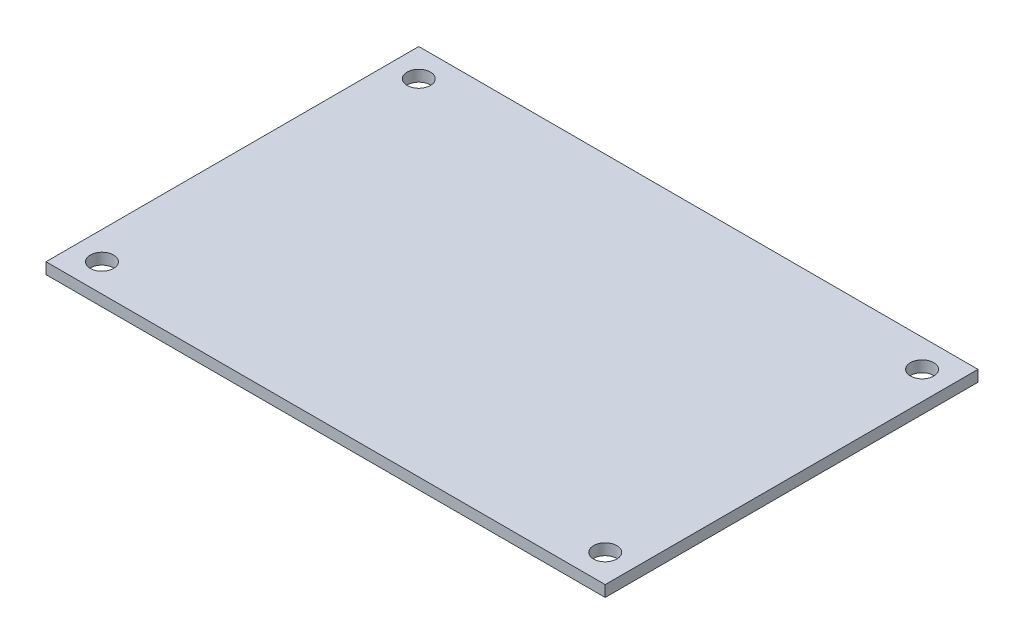
ISO-10303-21;
HEADER;
FILE_DESCRIPTION(('STEP AP214'),'2;1');
FILE_NAME('part.step','',(''),(''),'','','');
FILE_SCHEMA(('AUTOMOTIVE_DESIGN { 1 0 10303 214 1 1 1 1 }'));
ENDSEC;
DATA;
#1=APPLICATION_CONTEXT('core data for automotive mechanical design processes');
#2=APPLICATION_PROTOCOL_DEFINITION('international standard','automotive_design',2000,#1);
#3=PRODUCT_CONTEXT('',#1,'mechanical');
#4=PRODUCT('Part','Part','',(#3));
#5=PRODUCT_RELATED_PRODUCT_CATEGORY('part','',(#4));
#6=PRODUCT_DEFINITION_FORMATION('','',#4);
#7=PRODUCT_DEFINITION_CONTEXT('part definition',#1,'design');
#8=PRODUCT_DEFINITION('design','',#6,#7);
#9=PRODUCT_DEFINITION_SHAPE('','',#8);
#10=(LENGTH_UNIT() NAMED_UNIT(*) SI_UNIT(.MILLI.,.METRE.));
#11=(NAMED_UNIT(*) PLANE_ANGLE_UNIT() SI_UNIT($,.RADIAN.));
#12=(NAMED_UNIT(*) SI_UNIT($,.STERADIAN.) SOLID_ANGLE_UNIT());
#13=UNCERTAINTY_MEASURE_WITH_UNIT(LENGTH_MEASURE(1.E-05),#10,'distance_accuracy_value','');
#14=(GEOMETRIC_REPRESENTATION_CONTEXT(3) GLOBAL_UNCERTAINTY_ASSIGNED_CONTEXT((#13)) GLOBAL_UNIT_ASSIGNED_CONTEXT((#10,
#11,#12)) REPRESENTATION_CONTEXT('',''));
#15=CARTESIAN_POINT('',(0.,0.,0.));
#16=DIRECTION('',(0.,0.,1.));
#17=DIRECTION('',(1.,0.,0.));
#18=AXIS2_PLACEMENT_3D('',#15,#16,#17);
#19=CARTESIAN_POINT('',(0.,1.524,0.));
#20=DIRECTION('',(0.,-1.,0.));
#21=DIRECTION('',(0.,0.,-1.));
#22=AXIS2_PLACEMENT_3D('',#19,#20,#21);
#23=PLANE('',#22);
#24=CARTESIAN_POINT('',(-34.29,1.524,21.59));
#25=DIRECTION('',(0.,1.,0.));
#26=DIRECTION('',(0.,0.,1.));
#27=AXIS2_PLACEMENT_3D('',#24,#25,#26);
#28=CIRCLE('',#27,1.5875);
#29=CARTESIAN_POINT('',(-34.29,1.524,20.0025));
#30=VERTEX_POINT('',#29);
#31=EDGE_CURVE('E121',#30,#30,#28,.T.);
#32=ORIENTED_EDGE('',*,*,#31,.F.);
#33=EDGE_LOOP('',(#32));
#34=FACE_BOUND('',#33,.T.);
#35=CARTESIAN_POINT('',(34.29,1.524,-21.59));
#36=DIRECTION('',(0.,1.,0.));
#37=DIRECTION('',(0.,0.,1.));
#38=AXIS2_PLACEMENT_3D('',#35,#36,#37);
#39=CIRCLE('',#38,1.5875);
#40=CARTESIAN_POINT('',(34.29,1.524,-23.1775));
#41=VERTEX_POINT('',#40);
#42=EDGE_CURVE('E100',#41,#41,#39,.T.);
#43=ORIENTED_EDGE('',*,*,#42,.F.);
#44=EDGE_LOOP('',(#43));
#45=FACE_BOUND('',#44,.T.);
#46=DIRECTION('',(0.,0.,-1.));
#47=VECTOR('',#46,1.);
#48=CARTESIAN_POINT('',(38.1,1.524,25.4));
#49=LINE('',#48,#47);
#50=CARTESIAN_POINT('',(38.1,1.524,25.4));
#51=VERTEX_POINT('',#50);
#52=CARTESIAN_POINT('',(38.1,1.524,-25.4));
#53=VERTEX_POINT('',#52);
#54=EDGE_CURVE('E85',#51,#53,#49,.T.);
#55=ORIENTED_EDGE('',*,*,#54,.T.);
#56=DIRECTION('',(-1.,0.,0.));
#57=VECTOR('',#56,1.);
#58=CARTESIAN_POINT('',(-38.1,1.524,-25.4));
#59=LINE('',#58,#57);
#60=CARTESIAN_POINT('',(-38.1,1.524,-25.4));
#61=VERTEX_POINT('',#60);
#62=EDGE_CURVE('E80',#53,#61,#59,.T.);
#63=ORIENTED_EDGE('',*,*,#62,.T.);
#64=DIRECTION('',(0.,0.,1.));
#65=VECTOR('',#64,1.);
#66=CARTESIAN_POINT('',(-38.1,1.524,25.4));
#67=LINE('',#66,#65);
#68=CARTESIAN_POINT('',(-38.1,1.524,25.4));
#69=VERTEX_POINT('',#68);
#70=EDGE_CURVE('E83',#61,#69,#67,.T.);
#71=ORIENTED_EDGE('',*,*,#70,.T.);
#72=DIRECTION('',(1.,0.,0.));
#73=VECTOR('',#72,1.);
#74=CARTESIAN_POINT('',(-38.1,1.524,25.4));
#75=LINE('',#74,#73);
#76=EDGE_CURVE('E50',#69,#51,#75,.T.);
#77=ORIENTED_EDGE('',*,*,#76,.T.);
#78=EDGE_LOOP('',(#55,#63,#71,#77));
#79=FACE_BOUND('',#78,.T.);
#80=CARTESIAN_POINT('',(34.29,1.524,21.59));
#81=DIRECTION('',(0.,1.,0.));
#82=DIRECTION('',(0.,0.,1.));
#83=AXIS2_PLACEMENT_3D('',#80,#81,#82);
#84=CIRCLE('',#83,1.5875);
#85=CARTESIAN_POINT('',(34.29,1.524,20.0025));
#86=VERTEX_POINT('',#85);
#87=EDGE_CURVE('E115',#86,#86,#84,.T.);
#88=ORIENTED_EDGE('',*,*,#87,.F.);
#89=EDGE_LOOP('',(#88));
#90=FACE_BOUND('',#89,.T.);
#91=CARTESIAN_POINT('',(-34.29,1.524,-21.59));
#92=DIRECTION('',(0.,1.,0.));
#93=DIRECTION('',(0.,0.,1.));
#94=AXIS2_PLACEMENT_3D('',#91,#92,#93);
#95=CIRCLE('',#94,1.5875);
#96=CARTESIAN_POINT('',(-34.29,1.524,-23.1775));
#97=VERTEX_POINT('',#96);
#98=EDGE_CURVE('E127',#97,#97,#95,.T.);
#99=ORIENTED_EDGE('',*,*,#98,.F.);
#100=EDGE_LOOP('',(#99));
#101=FACE_BOUND('',#100,.T.);
#102=ADVANCED_FACE('F33',(#34,#45,#79,#90,#101),#23,.F.);
#103=CARTESIAN_POINT('',(0.,0.,0.));
#104=DIRECTION('',(0.,-1.,0.));
#105=DIRECTION('',(0.,0.,-1.));
#106=AXIS2_PLACEMENT_3D('',#103,#104,#105);
#107=PLANE('',#106);
#108=CARTESIAN_POINT('',(-34.29,0.,21.59));
#109=DIRECTION('',(0.,1.,0.));
#110=DIRECTION('',(0.,0.,1.));
#111=AXIS2_PLACEMENT_3D('',#108,#109,#110);
#112=CIRCLE('',#111,1.5875);
#113=CARTESIAN_POINT('',(-34.29,0.,20.0025));
#114=VERTEX_POINT('',#113);
#115=EDGE_CURVE('E124',#114,#114,#112,.T.);
#116=ORIENTED_EDGE('',*,*,#115,.T.);
#117=EDGE_LOOP('',(#116));
#118=FACE_BOUND('',#117,.T.);
#119=CARTESIAN_POINT('',(34.29,0.,-21.59));
#120=DIRECTION('',(0.,1.,0.));
#121=DIRECTION('',(0.,0.,1.));
#122=AXIS2_PLACEMENT_3D('',#119,#120,#121);
#123=CIRCLE('',#122,1.5875);
#124=CARTESIAN_POINT('',(34.29,0.,-23.1775));
#125=VERTEX_POINT('',#124);
#126=EDGE_CURVE('E112',#125,#125,#123,.T.);
#127=ORIENTED_EDGE('',*,*,#126,.T.);
#128=EDGE_LOOP('',(#127));
#129=FACE_BOUND('',#128,.T.);
#130=DIRECTION('',(0.,0.,-1.));
#131=VECTOR('',#130,1.);
#132=CARTESIAN_POINT('',(38.1,0.,25.4));
#133=LINE('',#132,#131);
#134=CARTESIAN_POINT('',(38.1,0.,25.4));
#135=VERTEX_POINT('',#134);
#136=CARTESIAN_POINT('',(38.1,0.,-25.4));
#137=VERTEX_POINT('',#136);
#138=EDGE_CURVE('E97',#135,#137,#133,.T.);
#139=ORIENTED_EDGE('',*,*,#138,.F.);
#140=DIRECTION('',(1.,0.,0.));
#141=VECTOR('',#140,1.);
#142=CARTESIAN_POINT('',(-38.1,0.,25.4));
#143=LINE('',#142,#141);
#144=CARTESIAN_POINT('',(-38.1,0.,25.4));
#145=VERTEX_POINT('',#144);
#146=EDGE_CURVE('E73',#145,#135,#143,.T.);
#147=ORIENTED_EDGE('',*,*,#146,.F.);
#148=DIRECTION('',(0.,0.,1.));
#149=VECTOR('',#148,1.);
#150=CARTESIAN_POINT('',(-38.1,0.,25.4));
#151=LINE('',#150,#149);
#152=CARTESIAN_POINT('',(-38.1,0.,-25.4));
#153=VERTEX_POINT('',#152);
#154=EDGE_CURVE('E67',#153,#145,#151,.T.);
#155=ORIENTED_EDGE('',*,*,#154,.F.);
#156=DIRECTION('',(-1.,0.,0.));
#157=VECTOR('',#156,1.);
#158=CARTESIAN_POINT('',(-38.1,0.,-25.4));
#159=LINE('',#158,#157);
#160=EDGE_CURVE('E89',#137,#153,#159,.T.);
#161=ORIENTED_EDGE('',*,*,#160,.F.);
#162=EDGE_LOOP('',(#139,#147,#155,#161));
#163=FACE_BOUND('',#162,.T.);
#164=CARTESIAN_POINT('',(34.29,0.,21.59));
#165=DIRECTION('',(0.,1.,0.));
#166=DIRECTION('',(0.,0.,1.));
#167=AXIS2_PLACEMENT_3D('',#164,#165,#166);
#168=CIRCLE('',#167,1.5875);
#169=CARTESIAN_POINT('',(34.29,0.,20.0025));
#170=VERTEX_POINT('',#169);
#171=EDGE_CURVE('E118',#170,#170,#168,.T.);
#172=ORIENTED_EDGE('',*,*,#171,.T.);
#173=EDGE_LOOP('',(#172));
#174=FACE_BOUND('',#173,.T.);
#175=CARTESIAN_POINT('',(-34.29,0.,-21.59));
#176=DIRECTION('',(0.,1.,0.));
#177=DIRECTION('',(0.,0.,1.));
#178=AXIS2_PLACEMENT_3D('',#175,#176,#177);
#179=CIRCLE('',#178,1.5875);
#180=CARTESIAN_POINT('',(-34.29,0.,-23.1775));
#181=VERTEX_POINT('',#180);
#182=EDGE_CURVE('E130',#181,#181,#179,.T.);
#183=ORIENTED_EDGE('',*,*,#182,.T.);
#184=EDGE_LOOP('',(#183));
#185=FACE_BOUND('',#184,.T.);
#186=ADVANCED_FACE('F108',(#118,#129,#163,#174,#185),#107,.T.);
#187=CARTESIAN_POINT('',(38.1,1.524,25.4));
#188=DIRECTION('',(-1.,0.,0.));
#189=DIRECTION('',(0.,0.,1.));
#190=AXIS2_PLACEMENT_3D('',#187,#188,#189);
#191=PLANE('',#190);
#192=ORIENTED_EDGE('',*,*,#138,.T.);
#193=DIRECTION('',(0.,-1.,0.));
#194=VECTOR('',#193,1.);
#195=CARTESIAN_POINT('',(38.1,1.524,-25.4));
#196=LINE('',#195,#194);
#197=EDGE_CURVE('E11',#53,#137,#196,.T.);
#198=ORIENTED_EDGE('',*,*,#197,.F.);
#199=ORIENTED_EDGE('',*,*,#54,.F.);
#200=DIRECTION('',(0.,-1.,0.));
#201=VECTOR('',#200,1.);
#202=CARTESIAN_POINT('',(38.1,1.524,25.4));
#203=LINE('',#202,#201);
#204=EDGE_CURVE('E93',#51,#135,#203,.T.);
#205=ORIENTED_EDGE('',*,*,#204,.T.);
#206=EDGE_LOOP('',(#192,#198,#199,#205));
#207=FACE_BOUND('',#206,.T.);
#208=ADVANCED_FACE('F35',(#207),#191,.F.);
#209=CARTESIAN_POINT('',(-38.1,1.524,-25.4));
#210=DIRECTION('',(0.,0.,1.));
#211=DIRECTION('',(1.,0.,0.));
#212=AXIS2_PLACEMENT_3D('',#209,#210,#211);
#213=PLANE('',#212);
#214=ORIENTED_EDGE('',*,*,#160,.T.);
#215=DIRECTION('',(0.,-1.,0.));
#216=VECTOR('',#215,1.);
#217=CARTESIAN_POINT('',(-38.1,1.524,-25.4));
#218=LINE('',#217,#216);
#219=EDGE_CURVE('E42',#61,#153,#218,.T.);
#220=ORIENTED_EDGE('',*,*,#219,.F.);
#221=ORIENTED_EDGE('',*,*,#62,.F.);
#222=ORIENTED_EDGE('',*,*,#197,.T.);
#223=EDGE_LOOP('',(#214,#220,#221,#222));
#224=FACE_BOUND('',#223,.T.);
#225=ADVANCED_FACE('F88',(#224),#213,.F.);
#226=CARTESIAN_POINT('',(-38.1,1.524,25.4));
#227=DIRECTION('',(1.,0.,0.));
#228=DIRECTION('',(0.,0.,-1.));
#229=AXIS2_PLACEMENT_3D('',#226,#227,#228);
#230=PLANE('',#229);
#231=ORIENTED_EDGE('',*,*,#154,.T.);
#232=DIRECTION('',(0.,-1.,0.));
#233=VECTOR('',#232,1.);
#234=CARTESIAN_POINT('',(-38.1,1.524,25.4));
#235=LINE('',#234,#233);
#236=EDGE_CURVE('E90',#69,#145,#235,.T.);
#237=ORIENTED_EDGE('',*,*,#236,.F.);
#238=ORIENTED_EDGE('',*,*,#70,.F.);
#239=ORIENTED_EDGE('',*,*,#219,.T.);
#240=EDGE_LOOP('',(#231,#237,#238,#239));
#241=FACE_BOUND('',#240,.T.);
#242=ADVANCED_FACE('F91',(#241),#230,.F.);
#243=CARTESIAN_POINT('',(-38.1,1.524,25.4));
#244=DIRECTION('',(0.,0.,-1.));
#245=DIRECTION('',(-1.,0.,0.));
#246=AXIS2_PLACEMENT_3D('',#243,#244,#245);
#247=PLANE('',#246);
#248=ORIENTED_EDGE('',*,*,#146,.T.);
#249=ORIENTED_EDGE('',*,*,#204,.F.);
#250=ORIENTED_EDGE('',*,*,#76,.F.);
#251=ORIENTED_EDGE('',*,*,#236,.T.);
#252=EDGE_LOOP('',(#248,#249,#250,#251));
#253=FACE_BOUND('',#252,.T.);
#254=ADVANCED_FACE('F105',(#253),#247,.F.);
#255=CARTESIAN_POINT('',(34.29,1.524,-21.59));
#256=DIRECTION('',(0.,-1.,0.));
#257=DIRECTION('',(0.,0.,-1.));
#258=AXIS2_PLACEMENT_3D('',#255,#256,#257);
#259=CYLINDRICAL_SURFACE('',#258,1.5875);
#260=CARTESIAN_POINT('',(34.29,1.524,-23.1775));
#261=CARTESIAN_POINT('',(34.29,1.508125,-23.1775));
#262=CARTESIAN_POINT('',(34.29,1.49225,-23.1775));
#263=CARTESIAN_POINT('',(34.29,1.4605,-23.1775));
#264=CARTESIAN_POINT('',(34.29,1.444625,-23.1775));
#265=CARTESIAN_POINT('',(34.29,1.412875,-23.1775));
#266=CARTESIAN_POINT('',(34.29,1.397,-23.1775));
#267=CARTESIAN_POINT('',(34.29,1.36525,-23.1775));
#268=CARTESIAN_POINT('',(34.29,1.349375,-23.1775));
#269=CARTESIAN_POINT('',(34.29,1.317625,-23.1775));
#270=CARTESIAN_POINT('',(34.29,1.30175,-23.1775));
#271=CARTESIAN_POINT('',(34.29,1.27,-23.1775));
#272=CARTESIAN_POINT('',(34.29,1.254125,-23.1775));
#273=CARTESIAN_POINT('',(34.29,1.222375,-23.1775));
#274=CARTESIAN_POINT('',(34.29,1.2065,-23.1775));
#275=CARTESIAN_POINT('',(34.29,1.17475,-23.1775));
#276=CARTESIAN_POINT('',(34.29,1.158875,-23.1775));
#277=CARTESIAN_POINT('',(34.29,1.127125,-23.1775));
#278=CARTESIAN_POINT('',(34.29,1.11125,-23.1775));
#279=CARTESIAN_POINT('',(34.29,1.0795,-23.1775));
#280=CARTESIAN_POINT('',(34.29,1.063625,-23.1775));
#281=CARTESIAN_POINT('',(34.29,1.031875,-23.1775));
#282=CARTESIAN_POINT('',(34.29,1.016,-23.1775));
#283=CARTESIAN_POINT('',(34.29,0.98425,-23.1775));
#284=CARTESIAN_POINT('',(34.29,0.968375,-23.1775));
#285=CARTESIAN_POINT('',(34.29,0.936625,-23.1775));
#286=CARTESIAN_POINT('',(34.29,0.92075,-23.1775));
#287=CARTESIAN_POINT('',(34.29,0.889,-23.1775));
#288=CARTESIAN_POINT('',(34.29,0.873125,-23.1775));
#289=CARTESIAN_POINT('',(34.29,0.841375,-23.1775));
#290=CARTESIAN_POINT('',(34.29,0.8255,-23.1775));
#291=CARTESIAN_POINT('',(34.29,0.79375,-23.1775));
#292=CARTESIAN_POINT('',(34.29,0.777875,-23.1775));
#293=CARTESIAN_POINT('',(34.29,0.746125,-23.1775));
#294=CARTESIAN_POINT('',(34.29,0.73025,-23.1775));
#295=CARTESIAN_POINT('',(34.29,0.6985,-23.1775));
#296=CARTESIAN_POINT('',(34.29,0.682625,-23.1775));
#297=CARTESIAN_POINT('',(34.29,0.650875,-23.1775));
#298=CARTESIAN_POINT('',(34.29,0.635,-23.1775));
#299=CARTESIAN_POINT('',(34.29,0.60325,-23.1775));
#300=CARTESIAN_POINT('',(34.29,0.587375,-23.1775));
#301=CARTESIAN_POINT('',(34.29,0.555625,-23.1775));
#302=CARTESIAN_POINT('',(34.29,0.53975,-23.1775));
#303=CARTESIAN_POINT('',(34.29,0.508,-23.1775));
#304=CARTESIAN_POINT('',(34.29,0.492125,-23.1775));
#305=CARTESIAN_POINT('',(34.29,0.460375,-23.1775));
#306=CARTESIAN_POINT('',(34.29,0.4445,-23.1775));
#307=CARTESIAN_POINT('',(34.29,0.41275,-23.1775));
#308=CARTESIAN_POINT('',(34.29,0.396875,-23.1775));
#309=CARTESIAN_POINT('',(34.29,0.365125,-23.1775));
#310=CARTESIAN_POINT('',(34.29,0.34925,-23.1775));
#311=CARTESIAN_POINT('',(34.29,0.3175,-23.1775));
#312=CARTESIAN_POINT('',(34.29,0.301625,-23.1775));
#313=CARTESIAN_POINT('',(34.29,0.269875,-23.1775));
#314=CARTESIAN_POINT('',(34.29,0.254,-23.1775));
#315=CARTESIAN_POINT('',(34.29,0.22225,-23.1775));
#316=CARTESIAN_POINT('',(34.29,0.206375,-23.1775));
#317=CARTESIAN_POINT('',(34.29,0.174625,-23.1775));
#318=CARTESIAN_POINT('',(34.29,0.15875,-23.1775));
#319=CARTESIAN_POINT('',(34.29,0.127,-23.1775));
#320=CARTESIAN_POINT('',(34.29,0.111125,-23.1775));
#321=CARTESIAN_POINT('',(34.29,0.079375,-23.1775));
#322=CARTESIAN_POINT('',(34.29,0.0635,-23.1775));
#323=CARTESIAN_POINT('',(34.29,0.0317499999999999,-23.1775));
#324=CARTESIAN_POINT('',(34.29,0.015875,-23.1775));
#325=CARTESIAN_POINT('',(34.29,0.,-23.1775));
#326=B_SPLINE_CURVE_WITH_KNOTS('',3,(#260,#261,#262,#263,#264,#265,#266,#267,#268,#269,#270,
#271,#272,#273,#274,#275,#276,#277,#278,#279,#280,#281,#282,#283,#284,#285,#286,#287,#288,#289,
#290,#291,#292,#293,#294,#295,#296,#297,#298,#299,#300,#301,#302,#303,#304,#305,#306,#307,#308,
#309,#310,#311,#312,#313,#314,#315,#316,#317,#318,#319,#320,#321,#322,#323,#324,#325),
.UNSPECIFIED.,.F.,.F.,(4,2,2,2,2,2,2,2,2,2,2,2,2,2,2,2,2,2,2,2,2,2,2,2,2,2,2,2,2,2,2,2,4),(0.,
0.0476250000000001,0.0952500000000001,0.142875,0.1905,0.238125,0.28575,0.333375,0.381,0.428625,
0.47625,0.523875,0.5715,0.619125,0.66675,0.714375,0.762,0.809625,0.85725,0.904875,0.9525,
1.000125,1.04775,1.095375,1.143,1.190625,1.23825,1.285875,1.3335,1.381125,1.42875,1.476375,
1.524),.UNSPECIFIED.);
#327=EDGE_CURVE('BSEAM150',#41,#125,#326,.T.);
#328=ORIENTED_EDGE('',*,*,#42,.T.);
#329=ORIENTED_EDGE('',*,*,#126,.F.);
#330=ORIENTED_EDGE('',*,*,#327,.T.);
#331=ORIENTED_EDGE('',*,*,#327,.F.);
#332=EDGE_LOOP('',(#328,#330,#329,#331));
#333=FACE_BOUND('',#332,.T.);
#334=ADVANCED_FACE('F150',(#333),#259,.F.);
#335=CARTESIAN_POINT('',(34.29,1.524,21.59));
#336=DIRECTION('',(0.,-1.,0.));
#337=DIRECTION('',(0.,0.,-1.));
#338=AXIS2_PLACEMENT_3D('',#335,#336,#337);
#339=CYLINDRICAL_SURFACE('',#338,1.5875);
#340=CARTESIAN_POINT('',(34.29,1.524,20.0025));
#341=CARTESIAN_POINT('',(34.29,1.508125,20.0025));
#342=CARTESIAN_POINT('',(34.29,1.49225,20.0025));
#343=CARTESIAN_POINT('',(34.29,1.4605,20.0025));
#344=CARTESIAN_POINT('',(34.29,1.444625,20.0025));
#345=CARTESIAN_POINT('',(34.29,1.412875,20.0025));
#346=CARTESIAN_POINT('',(34.29,1.397,20.0025));
#347=CARTESIAN_POINT('',(34.29,1.36525,20.0025));
#348=CARTESIAN_POINT('',(34.29,1.349375,20.0025));
#349=CARTESIAN_POINT('',(34.29,1.317625,20.0025));
#350=CARTESIAN_POINT('',(34.29,1.30175,20.0025));
#351=CARTESIAN_POINT('',(34.29,1.27,20.0025));
#352=CARTESIAN_POINT('',(34.29,1.254125,20.0025));
#353=CARTESIAN_POINT('',(34.29,1.222375,20.0025));
#354=CARTESIAN_POINT('',(34.29,1.2065,20.0025));
#355=CARTESIAN_POINT('',(34.29,1.17475,20.0025));
#356=CARTESIAN_POINT('',(34.29,1.158875,20.0025));
#357=CARTESIAN_POINT('',(34.29,1.127125,20.0025));
#358=CARTESIAN_POINT('',(34.29,1.11125,20.0025));
#359=CARTESIAN_POINT('',(34.29,1.0795,20.0025));
#360=CARTESIAN_POINT('',(34.29,1.063625,20.0025));
#361=CARTESIAN_POINT('',(34.29,1.031875,20.0025));
#362=CARTESIAN_POINT('',(34.29,1.016,20.0025));
#363=CARTESIAN_POINT('',(34.29,0.98425,20.0025));
#364=CARTESIAN_POINT('',(34.29,0.968375,20.0025));
#365=CARTESIAN_POINT('',(34.29,0.936625,20.0025));
#366=CARTESIAN_POINT('',(34.29,0.92075,20.0025));
#367=CARTESIAN_POINT('',(34.29,0.889,20.0025));
#368=CARTESIAN_POINT('',(34.29,0.873125,20.0025));
#369=CARTESIAN_POINT('',(34.29,0.841375,20.0025));
#370=CARTESIAN_POINT('',(34.29,0.8255,20.0025));
#371=CARTESIAN_POINT('',(34.29,0.79375,20.0025));
#372=CARTESIAN_POINT('',(34.29,0.777875,20.0025));
#373=CARTESIAN_POINT('',(34.29,0.746125,20.0025));
#374=CARTESIAN_POINT('',(34.29,0.73025,20.0025));
#375=CARTESIAN_POINT('',(34.29,0.6985,20.0025));
#376=CARTESIAN_POINT('',(34.29,0.682625,20.0025));
#377=CARTESIAN_POINT('',(34.29,0.650875,20.0025));
#378=CARTESIAN_POINT('',(34.29,0.635,20.0025));
#379=CARTESIAN_POINT('',(34.29,0.60325,20.0025));
#380=CARTESIAN_POINT('',(34.29,0.587375,20.0025));
#381=CARTESIAN_POINT('',(34.29,0.555625,20.0025));
#382=CARTESIAN_POINT('',(34.29,0.53975,20.0025));
#383=CARTESIAN_POINT('',(34.29,0.508,20.0025));
#384=CARTESIAN_POINT('',(34.29,0.492125,20.0025));
#385=CARTESIAN_POINT('',(34.29,0.460375,20.0025));
#386=CARTESIAN_POINT('',(34.29,0.4445,20.0025));
#387=CARTESIAN_POINT('',(34.29,0.41275,20.0025));
#388=CARTESIAN_POINT('',(34.29,0.396875,20.0025));
#389=CARTESIAN_POINT('',(34.29,0.365125,20.0025));
#390=CARTESIAN_POINT('',(34.29,0.34925,20.0025));
#391=CARTESIAN_POINT('',(34.29,0.3175,20.0025));
#392=CARTESIAN_POINT('',(34.29,0.301625,20.0025));
#393=CARTESIAN_POINT('',(34.29,0.269875,20.0025));
#394=CARTESIAN_POINT('',(34.29,0.254,20.0025));
#395=CARTESIAN_POINT('',(34.29,0.22225,20.0025));
#396=CARTESIAN_POINT('',(34.29,0.206375,20.0025));
#397=CARTESIAN_POINT('',(34.29,0.174625,20.0025));
#398=CARTESIAN_POINT('',(34.29,0.15875,20.0025));
#399=CARTESIAN_POINT('',(34.29,0.127,20.0025));
#400=CARTESIAN_POINT('',(34.29,0.111125,20.0025));
#401=CARTESIAN_POINT('',(34.29,0.079375,20.0025));
#402=CARTESIAN_POINT('',(34.29,0.0635,20.0025));
#403=CARTESIAN_POINT('',(34.29,0.0317499999999999,20.0025));
#404=CARTESIAN_POINT('',(34.29,0.015875,20.0025));
#405=CARTESIAN_POINT('',(34.29,0.,20.0025));
#406=B_SPLINE_CURVE_WITH_KNOTS('',3,(#340,#341,#342,#343,#344,#345,#346,#347,#348,#349,#350,
#351,#352,#353,#354,#355,#356,#357,#358,#359,#360,#361,#362,#363,#364,#365,#366,#367,#368,#369,
#370,#371,#372,#373,#374,#375,#376,#377,#378,#379,#380,#381,#382,#383,#384,#385,#386,#387,#388,
#389,#390,#391,#392,#393,#394,#395,#396,#397,#398,#399,#400,#401,#402,#403,#404,#405),
.UNSPECIFIED.,.F.,.F.,(4,2,2,2,2,2,2,2,2,2,2,2,2,2,2,2,2,2,2,2,2,2,2,2,2,2,2,2,2,2,2,2,4),(0.,
0.0476250000000001,0.0952500000000001,0.142875,0.1905,0.238125,0.28575,0.333375,0.381,0.428625,
0.47625,0.523875,0.5715,0.619125,0.66675,0.714375,0.762,0.809625,0.85725,0.904875,0.9525,
1.000125,1.04775,1.095375,1.143,1.190625,1.23825,1.285875,1.3335,1.381125,1.42875,1.476375,
1.524),.UNSPECIFIED.);
#407=EDGE_CURVE('BSEAM196',#86,#170,#406,.T.);
#408=ORIENTED_EDGE('',*,*,#87,.T.);
#409=ORIENTED_EDGE('',*,*,#171,.F.);
#410=ORIENTED_EDGE('',*,*,#407,.T.);
#411=ORIENTED_EDGE('',*,*,#407,.F.);
#412=EDGE_LOOP('',(#408,#410,#409,#411));
#413=FACE_BOUND('',#412,.T.);
#414=ADVANCED_FACE('F196',(#413),#339,.F.);
#415=CARTESIAN_POINT('',(-34.29,1.524,21.59));
#416=DIRECTION('',(0.,-1.,0.));
#417=DIRECTION('',(0.,0.,-1.));
#418=AXIS2_PLACEMENT_3D('',#415,#416,#417);
#419=CYLINDRICAL_SURFACE('',#418,1.5875);
#420=CARTESIAN_POINT('',(-34.29,1.524,20.0025));
#421=CARTESIAN_POINT('',(-34.29,1.508125,20.0025));
#422=CARTESIAN_POINT('',(-34.29,1.49225,20.0025));
#423=CARTESIAN_POINT('',(-34.29,1.4605,20.0025));
#424=CARTESIAN_POINT('',(-34.29,1.444625,20.0025));
#425=CARTESIAN_POINT('',(-34.29,1.412875,20.0025));
#426=CARTESIAN_POINT('',(-34.29,1.397,20.0025));
#427=CARTESIAN_POINT('',(-34.29,1.36525,20.0025));
#428=CARTESIAN_POINT('',(-34.29,1.349375,20.0025));
#429=CARTESIAN_POINT('',(-34.29,1.317625,20.0025));
#430=CARTESIAN_POINT('',(-34.29,1.30175,20.0025));
#431=CARTESIAN_POINT('',(-34.29,1.27,20.0025));
#432=CARTESIAN_POINT('',(-34.29,1.254125,20.0025));
#433=CARTESIAN_POINT('',(-34.29,1.222375,20.0025));
#434=CARTESIAN_POINT('',(-34.29,1.2065,20.0025));
#435=CARTESIAN_POINT('',(-34.29,1.17475,20.0025));
#436=CARTESIAN_POINT('',(-34.29,1.158875,20.0025));
#437=CARTESIAN_POINT('',(-34.29,1.127125,20.0025));
#438=CARTESIAN_POINT('',(-34.29,1.11125,20.0025));
#439=CARTESIAN_POINT('',(-34.29,1.0795,20.0025));
#440=CARTESIAN_POINT('',(-34.29,1.063625,20.0025));
#441=CARTESIAN_POINT('',(-34.29,1.031875,20.0025));
#442=CARTESIAN_POINT('',(-34.29,1.016,20.0025));
#443=CARTESIAN_POINT('',(-34.29,0.98425,20.0025));
#444=CARTESIAN_POINT('',(-34.29,0.968375,20.0025));
#445=CARTESIAN_POINT('',(-34.29,0.936625,20.0025));
#446=CARTESIAN_POINT('',(-34.29,0.92075,20.0025));
#447=CARTESIAN_POINT('',(-34.29,0.889,20.0025));
#448=CARTESIAN_POINT('',(-34.29,0.873125,20.0025));
#449=CARTESIAN_POINT('',(-34.29,0.841375,20.0025));
#450=CARTESIAN_POINT('',(-34.29,0.8255,20.0025));
#451=CARTESIAN_POINT('',(-34.29,0.79375,20.0025));
#452=CARTESIAN_POINT('',(-34.29,0.777875,20.0025));
#453=CARTESIAN_POINT('',(-34.29,0.746125,20.0025));
#454=CARTESIAN_POINT('',(-34.29,0.73025,20.0025));
#455=CARTESIAN_POINT('',(-34.29,0.6985,20.0025));
#456=CARTESIAN_POINT('',(-34.29,0.682625,20.0025));
#457=CARTESIAN_POINT('',(-34.29,0.650875,20.0025));
#458=CARTESIAN_POINT('',(-34.29,0.635,20.0025));
#459=CARTESIAN_POINT('',(-34.29,0.60325,20.0025));
#460=CARTESIAN_POINT('',(-34.29,0.587375,20.0025));
#461=CARTESIAN_POINT('',(-34.29,0.555625,20.0025));
#462=CARTESIAN_POINT('',(-34.29,0.53975,20.0025));
#463=CARTESIAN_POINT('',(-34.29,0.508,20.0025));
#464=CARTESIAN_POINT('',(-34.29,0.492125,20.0025));
#465=CARTESIAN_POINT('',(-34.29,0.460375,20.0025));
#466=CARTESIAN_POINT('',(-34.29,0.4445,20.0025));
#467=CARTESIAN_POINT('',(-34.29,0.41275,20.0025));
#468=CARTESIAN_POINT('',(-34.29,0.396875,20.0025));
#469=CARTESIAN_POINT('',(-34.29,0.365125,20.0025));
#470=CARTESIAN_POINT('',(-34.29,0.34925,20.0025));
#471=CARTESIAN_POINT('',(-34.29,0.3175,20.0025));
#472=CARTESIAN_POINT('',(-34.29,0.301625,20.0025));
#473=CARTESIAN_POINT('',(-34.29,0.269875,20.0025));
#474=CARTESIAN_POINT('',(-34.29,0.254,20.0025));
#475=CARTESIAN_POINT('',(-34.29,0.22225,20.0025));
#476=CARTESIAN_POINT('',(-34.29,0.206375,20.0025));
#477=CARTESIAN_POINT('',(-34.29,0.174625,20.0025));
#478=CARTESIAN_POINT('',(-34.29,0.15875,20.0025));
#479=CARTESIAN_POINT('',(-34.29,0.127,20.0025));
#480=CARTESIAN_POINT('',(-34.29,0.111125,20.0025));
#481=CARTESIAN_POINT('',(-34.29,0.079375,20.0025));
#482=CARTESIAN_POINT('',(-34.29,0.0635,20.0025));
#483=CARTESIAN_POINT('',(-34.29,0.0317499999999999,20.0025));
#484=CARTESIAN_POINT('',(-34.29,0.015875,20.0025));
#485=CARTESIAN_POINT('',(-34.29,0.,20.0025));
#486=B_SPLINE_CURVE_WITH_KNOTS('',3,(#420,#421,#422,#423,#424,#425,#426,#427,#428,#429,#430,
#431,#432,#433,#434,#435,#436,#437,#438,#439,#440,#441,#442,#443,#444,#445,#446,#447,#448,#449,
#450,#451,#452,#453,#454,#455,#456,#457,#458,#459,#460,#461,#462,#463,#464,#465,#466,#467,#468,
#469,#470,#471,#472,#473,#474,#475,#476,#477,#478,#479,#480,#481,#482,#483,#484,#485),
.UNSPECIFIED.,.F.,.F.,(4,2,2,2,2,2,2,2,2,2,2,2,2,2,2,2,2,2,2,2,2,2,2,2,2,2,2,2,2,2,2,2,4),(0.,
0.0476250000000001,0.0952500000000001,0.142875,0.1905,0.238125,0.28575,0.333375,0.381,0.428625,
0.47625,0.523875,0.5715,0.619125,0.66675,0.714375,0.762,0.809625,0.85725,0.904875,0.9525,
1.000125,1.04775,1.095375,1.143,1.190625,1.23825,1.285875,1.3335,1.381125,1.42875,1.476375,
1.524),.UNSPECIFIED.);
#487=EDGE_CURVE('BSEAM204',#30,#114,#486,.T.);
#488=ORIENTED_EDGE('',*,*,#31,.T.);
#489=ORIENTED_EDGE('',*,*,#115,.F.);
#490=ORIENTED_EDGE('',*,*,#487,.T.);
#491=ORIENTED_EDGE('',*,*,#487,.F.);
#492=EDGE_LOOP('',(#488,#490,#489,#491));
#493=FACE_BOUND('',#492,.T.);
#494=ADVANCED_FACE('F204',(#493),#419,.F.);
#495=CARTESIAN_POINT('',(-34.29,1.524,-21.59));
#496=DIRECTION('',(0.,-1.,0.));
#497=DIRECTION('',(0.,0.,-1.));
#498=AXIS2_PLACEMENT_3D('',#495,#496,#497);
#499=CYLINDRICAL_SURFACE('',#498,1.5875);
#500=CARTESIAN_POINT('',(-34.29,1.524,-23.1775));
#501=CARTESIAN_POINT('',(-34.29,1.508125,-23.1775));
#502=CARTESIAN_POINT('',(-34.29,1.49225,-23.1775));
#503=CARTESIAN_POINT('',(-34.29,1.4605,-23.1775));
#504=CARTESIAN_POINT('',(-34.29,1.444625,-23.1775));
#505=CARTESIAN_POINT('',(-34.29,1.412875,-23.1775));
#506=CARTESIAN_POINT('',(-34.29,1.397,-23.1775));
#507=CARTESIAN_POINT('',(-34.29,1.36525,-23.1775));
#508=CARTESIAN_POINT('',(-34.29,1.349375,-23.1775));
#509=CARTESIAN_POINT('',(-34.29,1.317625,-23.1775));
#510=CARTESIAN_POINT('',(-34.29,1.30175,-23.1775));
#511=CARTESIAN_POINT('',(-34.29,1.27,-23.1775));
#512=CARTESIAN_POINT('',(-34.29,1.254125,-23.1775));
#513=CARTESIAN_POINT('',(-34.29,1.222375,-23.1775));
#514=CARTESIAN_POINT('',(-34.29,1.2065,-23.1775));
#515=CARTESIAN_POINT('',(-34.29,1.17475,-23.1775));
#516=CARTESIAN_POINT('',(-34.29,1.158875,-23.1775));
#517=CARTESIAN_POINT('',(-34.29,1.127125,-23.1775));
#518=CARTESIAN_POINT('',(-34.29,1.11125,-23.1775));
#519=CARTESIAN_POINT('',(-34.29,1.0795,-23.1775));
#520=CARTESIAN_POINT('',(-34.29,1.063625,-23.1775));
#521=CARTESIAN_POINT('',(-34.29,1.031875,-23.1775));
#522=CARTESIAN_POINT('',(-34.29,1.016,-23.1775));
#523=CARTESIAN_POINT('',(-34.29,0.98425,-23.1775));
#524=CARTESIAN_POINT('',(-34.29,0.968375,-23.1775));
#525=CARTESIAN_POINT('',(-34.29,0.936625,-23.1775));
#526=CARTESIAN_POINT('',(-34.29,0.92075,-23.1775));
#527=CARTESIAN_POINT('',(-34.29,0.889,-23.1775));
#528=CARTESIAN_POINT('',(-34.29,0.873125,-23.1775));
#529=CARTESIAN_POINT('',(-34.29,0.841375,-23.1775));
#530=CARTESIAN_POINT('',(-34.29,0.8255,-23.1775));
#531=CARTESIAN_POINT('',(-34.29,0.79375,-23.1775));
#532=CARTESIAN_POINT('',(-34.29,0.777875,-23.1775));
#533=CARTESIAN_POINT('',(-34.29,0.746125,-23.1775));
#534=CARTESIAN_POINT('',(-34.29,0.73025,-23.1775));
#535=CARTESIAN_POINT('',(-34.29,0.6985,-23.1775));
#536=CARTESIAN_POINT('',(-34.29,0.682625,-23.1775));
#537=CARTESIAN_POINT('',(-34.29,0.650875,-23.1775));
#538=CARTESIAN_POINT('',(-34.29,0.635,-23.1775));
#539=CARTESIAN_POINT('',(-34.29,0.60325,-23.1775));
#540=CARTESIAN_POINT('',(-34.29,0.587375,-23.1775));
#541=CARTESIAN_POINT('',(-34.29,0.555625,-23.1775));
#542=CARTESIAN_POINT('',(-34.29,0.53975,-23.1775));
#543=CARTESIAN_POINT('',(-34.29,0.508,-23.1775));
#544=CARTESIAN_POINT('',(-34.29,0.492125,-23.1775));
#545=CARTESIAN_POINT('',(-34.29,0.460375,-23.1775));
#546=CARTESIAN_POINT('',(-34.29,0.4445,-23.1775));
#547=CARTESIAN_POINT('',(-34.29,0.41275,-23.1775));
#548=CARTESIAN_POINT('',(-34.29,0.396875,-23.1775));
#549=CARTESIAN_POINT('',(-34.29,0.365125,-23.1775));
#550=CARTESIAN_POINT('',(-34.29,0.34925,-23.1775));
#551=CARTESIAN_POINT('',(-34.29,0.3175,-23.1775));
#552=CARTESIAN_POINT('',(-34.29,0.301625,-23.1775));
#553=CARTESIAN_POINT('',(-34.29,0.269875,-23.1775));
#554=CARTESIAN_POINT('',(-34.29,0.254,-23.1775));
#555=CARTESIAN_POINT('',(-34.29,0.22225,-23.1775));
#556=CARTESIAN_POINT('',(-34.29,0.206375,-23.1775));
#557=CARTESIAN_POINT('',(-34.29,0.174625,-23.1775));
#558=CARTESIAN_POINT('',(-34.29,0.15875,-23.1775));
#559=CARTESIAN_POINT('',(-34.29,0.127,-23.1775));
#560=CARTESIAN_POINT('',(-34.29,0.111125,-23.1775));
#561=CARTESIAN_POINT('',(-34.29,0.079375,-23.1775));
#562=CARTESIAN_POINT('',(-34.29,0.0635,-23.1775));
#563=CARTESIAN_POINT('',(-34.29,0.0317499999999999,-23.1775));
#564=CARTESIAN_POINT('',(-34.29,0.015875,-23.1775));
#565=CARTESIAN_POINT('',(-34.29,0.,-23.1775));
#566=B_SPLINE_CURVE_WITH_KNOTS('',3,(#500,#501,#502,#503,#504,#505,#506,#507,#508,#509,#510,
#511,#512,#513,#514,#515,#516,#517,#518,#519,#520,#521,#522,#523,#524,#525,#526,#527,#528,#529,
#530,#531,#532,#533,#534,#535,#536,#537,#538,#539,#540,#541,#542,#543,#544,#545,#546,#547,#548,
#549,#550,#551,#552,#553,#554,#555,#556,#557,#558,#559,#560,#561,#562,#563,#564,#565),
.UNSPECIFIED.,.F.,.F.,(4,2,2,2,2,2,2,2,2,2,2,2,2,2,2,2,2,2,2,2,2,2,2,2,2,2,2,2,2,2,2,2,4),(0.,
0.0476250000000001,0.0952500000000001,0.142875,0.1905,0.238125,0.28575,0.333375,0.381,0.428625,
0.47625,0.523875,0.5715,0.619125,0.66675,0.714375,0.762,0.809625,0.85725,0.904875,0.9525,
1.000125,1.04775,1.095375,1.143,1.190625,1.23825,1.285875,1.3335,1.381125,1.42875,1.476375,
1.524),.UNSPECIFIED.);
#567=EDGE_CURVE('BSEAM136',#97,#181,#566,.T.);
#568=ORIENTED_EDGE('',*,*,#98,.T.);
#569=ORIENTED_EDGE('',*,*,#182,.F.);
#570=ORIENTED_EDGE('',*,*,#567,.T.);
#571=ORIENTED_EDGE('',*,*,#567,.F.);
#572=EDGE_LOOP('',(#568,#570,#569,#571));
#573=FACE_BOUND('',#572,.T.);
#574=ADVANCED_FACE('F136',(#573),#499,.F.);
#575=CLOSED_SHELL('',(#102,#186,#208,#225,#242,#254,#334,#414,#494,#574));
#576=MANIFOLD_SOLID_BREP('B2',#575);
#577=ADVANCED_BREP_SHAPE_REPRESENTATION('',(#18,#576),#14);
#578=SHAPE_DEFINITION_REPRESENTATION(#9,#577);
ENDSEC;
END-ISO-10303-21;
